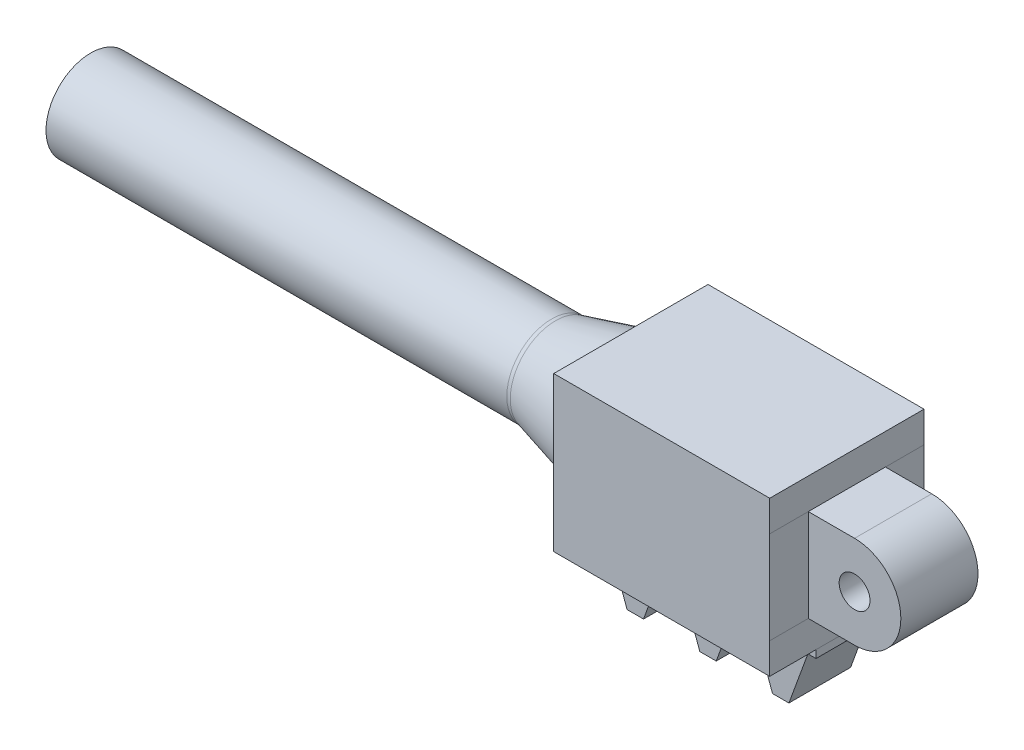
ISO-10303-21;
HEADER;
FILE_DESCRIPTION(('STEP AP214'),'2;1');
FILE_NAME('part.step','',(''),(''),'','','');
FILE_SCHEMA(('AUTOMOTIVE_DESIGN { 1 0 10303 214 1 1 1 1 }'));
ENDSEC;
DATA;
#1=APPLICATION_CONTEXT('core data for automotive mechanical design processes');
#2=APPLICATION_PROTOCOL_DEFINITION('international standard','automotive_design',2000,#1);
#3=PRODUCT_CONTEXT('',#1,'mechanical');
#4=PRODUCT('Part','Part','',(#3));
#5=PRODUCT_RELATED_PRODUCT_CATEGORY('part','',(#4));
#6=PRODUCT_DEFINITION_FORMATION('','',#4);
#7=PRODUCT_DEFINITION_CONTEXT('part definition',#1,'design');
#8=PRODUCT_DEFINITION('design','',#6,#7);
#9=PRODUCT_DEFINITION_SHAPE('','',#8);
#10=(LENGTH_UNIT() NAMED_UNIT(*) SI_UNIT(.MILLI.,.METRE.));
#11=(NAMED_UNIT(*) PLANE_ANGLE_UNIT() SI_UNIT($,.RADIAN.));
#12=(NAMED_UNIT(*) SI_UNIT($,.STERADIAN.) SOLID_ANGLE_UNIT());
#13=UNCERTAINTY_MEASURE_WITH_UNIT(LENGTH_MEASURE(1.E-05),#10,'distance_accuracy_value','');
#14=(GEOMETRIC_REPRESENTATION_CONTEXT(3) GLOBAL_UNCERTAINTY_ASSIGNED_CONTEXT((#13)) GLOBAL_UNIT_ASSIGNED_CONTEXT((#10,
#11,#12)) REPRESENTATION_CONTEXT('',''));
#15=CARTESIAN_POINT('',(0.,0.,0.));
#16=DIRECTION('',(0.,0.,1.));
#17=DIRECTION('',(1.,0.,0.));
#18=AXIS2_PLACEMENT_3D('',#15,#16,#17);
#19=CARTESIAN_POINT('',(3.00000009685755,-4.93749997019768,2.));
#20=DIRECTION('',(0.,0.,1.));
#21=DIRECTION('',(1.,0.,0.));
#22=AXIS2_PLACEMENT_3D('',#19,#20,#21);
#23=PLANE('',#22);
#24=DIRECTION('',(0.,-1.,0.));
#25=VECTOR('',#24,1.);
#26=CARTESIAN_POINT('',(-7.,-8.,2.));
#27=LINE('',#26,#25);
#28=CARTESIAN_POINT('',(-7.,-8.,2.));
#29=VERTEX_POINT('',#28);
#30=CARTESIAN_POINT('',(-7.,-8.5,2.));
#31=VERTEX_POINT('',#30);
#32=EDGE_CURVE('E9',#29,#31,#27,.T.);
#33=ORIENTED_EDGE('',*,*,#32,.T.);
#34=DIRECTION('',(1.,0.,0.));
#35=VECTOR('',#34,1.);
#36=CARTESIAN_POINT('',(-7.,-8.5,2.));
#37=LINE('',#36,#35);
#38=CARTESIAN_POINT('',(-6.47293,-8.5,2.));
#39=VERTEX_POINT('',#38);
#40=EDGE_CURVE('E18',#31,#39,#37,.T.);
#41=ORIENTED_EDGE('',*,*,#40,.T.);
#42=DIRECTION('',(0.342020010403122,-0.939692669165748,0.));
#43=VECTOR('',#42,1.);
#44=CARTESIAN_POINT('',(-6.47293,-8.5,2.));
#45=LINE('',#44,#43);
#46=CARTESIAN_POINT('',(-5.244531,-11.875,2.));
#47=VERTEX_POINT('',#46);
#48=EDGE_CURVE('E211',#39,#47,#45,.T.);
#49=ORIENTED_EDGE('',*,*,#48,.T.);
#50=DIRECTION('',(1.,0.,0.));
#51=VECTOR('',#50,1.);
#52=CARTESIAN_POINT('',(-5.244531,-11.875,2.));
#53=LINE('',#52,#51);
#54=CARTESIAN_POINT('',(-4.180247,-11.875,2.));
#55=VERTEX_POINT('',#54);
#56=EDGE_CURVE('E204',#47,#55,#53,.T.);
#57=ORIENTED_EDGE('',*,*,#56,.T.);
#58=DIRECTION('',(0.342020010403122,0.939692669165748,0.));
#59=VECTOR('',#58,1.);
#60=CARTESIAN_POINT('',(-4.180247,-11.875,2.));
#61=LINE('',#60,#59);
#62=CARTESIAN_POINT('',(-2.951848,-8.5,2.));
#63=VERTEX_POINT('',#62);
#64=EDGE_CURVE('E208',#55,#63,#61,.T.);
#65=ORIENTED_EDGE('',*,*,#64,.T.);
#66=DIRECTION('',(1.,0.,0.));
#67=VECTOR('',#66,1.);
#68=CARTESIAN_POINT('',(-2.951848,-8.5,2.));
#69=LINE('',#68,#67);
#70=CARTESIAN_POINT('',(-1.760541,-8.5,2.));
#71=VERTEX_POINT('',#70);
#72=EDGE_CURVE('E240',#63,#71,#69,.T.);
#73=ORIENTED_EDGE('',*,*,#72,.T.);
#74=DIRECTION('',(0.342020010403122,-0.939692669165748,0.));
#75=VECTOR('',#74,1.);
#76=CARTESIAN_POINT('',(-1.760541,-8.5,2.));
#77=LINE('',#76,#75);
#78=CARTESIAN_POINT('',(-0.532142,-11.875,2.));
#79=VERTEX_POINT('',#78);
#80=EDGE_CURVE('E237',#71,#79,#77,.T.);
#81=ORIENTED_EDGE('',*,*,#80,.T.);
#82=DIRECTION('',(1.,0.,0.));
#83=VECTOR('',#82,1.);
#84=CARTESIAN_POINT('',(-0.532142,-11.875,2.));
#85=LINE('',#84,#83);
#86=CARTESIAN_POINT('',(0.532142,-11.875,2.));
#87=VERTEX_POINT('',#86);
#88=EDGE_CURVE('E461',#79,#87,#85,.T.);
#89=ORIENTED_EDGE('',*,*,#88,.T.);
#90=DIRECTION('',(0.342020010403122,0.939692669165748,0.));
#91=VECTOR('',#90,1.);
#92=CARTESIAN_POINT('',(0.532142,-11.875,2.));
#93=LINE('',#92,#91);
#94=CARTESIAN_POINT('',(1.760541,-8.5,2.));
#95=VERTEX_POINT('',#94);
#96=EDGE_CURVE('E441',#87,#95,#93,.T.);
#97=ORIENTED_EDGE('',*,*,#96,.T.);
#98=DIRECTION('',(1.,0.,0.));
#99=VECTOR('',#98,1.);
#100=CARTESIAN_POINT('',(1.760541,-8.5,2.));
#101=LINE('',#100,#99);
#102=CARTESIAN_POINT('',(2.951848,-8.5,2.));
#103=VERTEX_POINT('',#102);
#104=EDGE_CURVE('E443',#95,#103,#101,.T.);
#105=ORIENTED_EDGE('',*,*,#104,.T.);
#106=DIRECTION('',(0.342020010403122,-0.939692669165748,0.));
#107=VECTOR('',#106,1.);
#108=CARTESIAN_POINT('',(2.951848,-8.5,2.));
#109=LINE('',#108,#107);
#110=CARTESIAN_POINT('',(4.180247,-11.875,2.));
#111=VERTEX_POINT('',#110);
#112=EDGE_CURVE('E480',#103,#111,#109,.T.);
#113=ORIENTED_EDGE('',*,*,#112,.T.);
#114=DIRECTION('',(1.,0.,0.));
#115=VECTOR('',#114,1.);
#116=CARTESIAN_POINT('',(4.180247,-11.875,2.));
#117=LINE('',#116,#115);
#118=CARTESIAN_POINT('',(5.244531,-11.875,2.));
#119=VERTEX_POINT('',#118);
#120=EDGE_CURVE('E292',#111,#119,#117,.T.);
#121=ORIENTED_EDGE('',*,*,#120,.T.);
#122=DIRECTION('',(0.342020010403122,0.939692669165748,0.));
#123=VECTOR('',#122,1.);
#124=CARTESIAN_POINT('',(5.244531,-11.875,2.));
#125=LINE('',#124,#123);
#126=CARTESIAN_POINT('',(6.47293,-8.5,2.));
#127=VERTEX_POINT('',#126);
#128=EDGE_CURVE('E369',#119,#127,#125,.T.);
#129=ORIENTED_EDGE('',*,*,#128,.T.);
#130=DIRECTION('',(1.,0.,0.));
#131=VECTOR('',#130,1.);
#132=CARTESIAN_POINT('',(6.47293,-8.5,2.));
#133=LINE('',#132,#131);
#134=CARTESIAN_POINT('',(7.,-8.5,2.));
#135=VERTEX_POINT('',#134);
#136=EDGE_CURVE('E464',#127,#135,#133,.T.);
#137=ORIENTED_EDGE('',*,*,#136,.T.);
#138=DIRECTION('',(0.,1.,0.));
#139=VECTOR('',#138,1.);
#140=CARTESIAN_POINT('',(7.,-8.5,2.));
#141=LINE('',#140,#139);
#142=CARTESIAN_POINT('',(7.,-8.,2.));
#143=VERTEX_POINT('',#142);
#144=EDGE_CURVE('E460',#135,#143,#141,.T.);
#145=ORIENTED_EDGE('',*,*,#144,.T.);
#146=DIRECTION('',(-1.,0.,0.));
#147=VECTOR('',#146,1.);
#148=CARTESIAN_POINT('',(7.,-8.,2.));
#149=LINE('',#148,#147);
#150=EDGE_CURVE('E338',#143,#29,#149,.T.);
#151=ORIENTED_EDGE('',*,*,#150,.T.);
#152=EDGE_LOOP('',(#33,#41,#49,#57,#65,#73,#81,#89,#97,#105,#113,#121,#129,#137,#145,#151));
#153=FACE_BOUND('',#152,.T.);
#154=ADVANCED_FACE('F15',(#153),#23,.T.);
#155=CARTESIAN_POINT('',(-7.,-8.,0.));
#156=DIRECTION('',(-1.,0.,0.));
#157=DIRECTION('',(0.,0.,1.));
#158=AXIS2_PLACEMENT_3D('',#155,#156,#157);
#159=PLANE('',#158);
#160=CARTESIAN_POINT('',(-7.,-2.89997804685105,0.0112839612717951));
#161=DIRECTION('',(1.,0.,0.));
#162=DIRECTION('',(0.,0.,-1.));
#163=AXIS2_PLACEMENT_3D('',#160,#161,#162);
#164=CIRCLE('',#163,4.23974596215561);
#165=CARTESIAN_POINT('',(-7.,-2.89997804685105,4.25102992342741));
#166=VERTEX_POINT('',#165);
#167=EDGE_CURVE('E615',#166,#166,#164,.T.);
#168=ORIENTED_EDGE('',*,*,#167,.T.);
#169=EDGE_LOOP('',(#168));
#170=FACE_BOUND('',#169,.T.);
#171=DIRECTION('',(0.,0.,1.));
#172=VECTOR('',#171,1.);
#173=CARTESIAN_POINT('',(-7.,-8.5,0.));
#174=LINE('',#173,#172);
#175=CARTESIAN_POINT('',(-7.,-8.5,-2.));
#176=VERTEX_POINT('',#175);
#177=EDGE_CURVE('E24',#176,#31,#174,.T.);
#178=ORIENTED_EDGE('',*,*,#177,.T.);
#179=ORIENTED_EDGE('',*,*,#32,.F.);
#180=DIRECTION('',(0.,0.,1.));
#181=VECTOR('',#180,1.);
#182=CARTESIAN_POINT('',(-7.,-8.,0.));
#183=LINE('',#182,#181);
#184=CARTESIAN_POINT('',(-7.,-8.,5.));
#185=VERTEX_POINT('',#184);
#186=EDGE_CURVE('E354',#29,#185,#183,.T.);
#187=ORIENTED_EDGE('',*,*,#186,.T.);
#188=DIRECTION('',(0.,-1.,0.));
#189=VECTOR('',#188,1.);
#190=CARTESIAN_POINT('',(-7.,2.00000005960464,5.));
#191=LINE('',#190,#189);
#192=CARTESIAN_POINT('',(-7.,2.00000005960464,5.));
#193=VERTEX_POINT('',#192);
#194=EDGE_CURVE('E394',#193,#185,#191,.T.);
#195=ORIENTED_EDGE('',*,*,#194,.F.);
#196=DIRECTION('',(0.,0.,1.));
#197=VECTOR('',#196,1.);
#198=CARTESIAN_POINT('',(-7.,2.00000005960464,0.));
#199=LINE('',#198,#197);
#200=CARTESIAN_POINT('',(-7.,2.00000005960464,-5.));
#201=VERTEX_POINT('',#200);
#202=EDGE_CURVE('E384',#201,#193,#199,.T.);
#203=ORIENTED_EDGE('',*,*,#202,.F.);
#204=DIRECTION('',(0.,1.,0.));
#205=VECTOR('',#204,1.);
#206=CARTESIAN_POINT('',(-7.,2.00000005960464,-5.));
#207=LINE('',#206,#205);
#208=CARTESIAN_POINT('',(-7.,-8.,-5.));
#209=VERTEX_POINT('',#208);
#210=EDGE_CURVE('E350',#209,#201,#207,.T.);
#211=ORIENTED_EDGE('',*,*,#210,.F.);
#212=DIRECTION('',(0.,0.,1.));
#213=VECTOR('',#212,1.);
#214=CARTESIAN_POINT('',(-7.,-8.,0.));
#215=LINE('',#214,#213);
#216=CARTESIAN_POINT('',(-7.,-8.,-2.));
#217=VERTEX_POINT('',#216);
#218=EDGE_CURVE('E313',#209,#217,#215,.T.);
#219=ORIENTED_EDGE('',*,*,#218,.T.);
#220=DIRECTION('',(0.,1.,0.));
#221=VECTOR('',#220,1.);
#222=CARTESIAN_POINT('',(-7.,-8.,-2.));
#223=LINE('',#222,#221);
#224=EDGE_CURVE('E396',#176,#217,#223,.T.);
#225=ORIENTED_EDGE('',*,*,#224,.F.);
#226=EDGE_LOOP('',(#178,#179,#187,#195,#203,#211,#219,#225));
#227=FACE_BOUND('',#226,.T.);
#228=ADVANCED_FACE('F698',(#170,#227),#159,.T.);
#229=CARTESIAN_POINT('',(-7.,-8.5,0.));
#230=DIRECTION('',(0.,-1.,0.));
#231=DIRECTION('',(0.,0.,-1.));
#232=AXIS2_PLACEMENT_3D('',#229,#230,#231);
#233=PLANE('',#232);
#234=DIRECTION('',(0.,0.,1.));
#235=VECTOR('',#234,1.);
#236=CARTESIAN_POINT('',(-6.47293,-8.5,0.));
#237=LINE('',#236,#235);
#238=CARTESIAN_POINT('',(-6.47293,-8.5,-2.));
#239=VERTEX_POINT('',#238);
#240=EDGE_CURVE('E242',#239,#39,#237,.T.);
#241=ORIENTED_EDGE('',*,*,#240,.T.);
#242=ORIENTED_EDGE('',*,*,#40,.F.);
#243=ORIENTED_EDGE('',*,*,#177,.F.);
#244=DIRECTION('',(-1.,0.,0.));
#245=VECTOR('',#244,1.);
#246=CARTESIAN_POINT('',(-7.,-8.5,-2.));
#247=LINE('',#246,#245);
#248=EDGE_CURVE('E455',#239,#176,#247,.T.);
#249=ORIENTED_EDGE('',*,*,#248,.F.);
#250=EDGE_LOOP('',(#241,#242,#243,#249));
#251=FACE_BOUND('',#250,.T.);
#252=ADVANCED_FACE('F697',(#251),#233,.T.);
#253=CARTESIAN_POINT('',(-6.47293,-8.5,0.));
#254=DIRECTION('',(-0.939692669165748,-0.342020010403122,0.));
#255=DIRECTION('',(-0.342020010403122,0.939692669165748,0.));
#256=AXIS2_PLACEMENT_3D('',#253,#254,#255);
#257=PLANE('',#256);
#258=DIRECTION('',(0.,0.,1.));
#259=VECTOR('',#258,1.);
#260=CARTESIAN_POINT('',(-5.244531,-11.875,0.));
#261=LINE('',#260,#259);
#262=CARTESIAN_POINT('',(-5.244531,-11.875,-2.));
#263=VERTEX_POINT('',#262);
#264=EDGE_CURVE('E214',#263,#47,#261,.T.);
#265=ORIENTED_EDGE('',*,*,#264,.T.);
#266=ORIENTED_EDGE('',*,*,#48,.F.);
#267=ORIENTED_EDGE('',*,*,#240,.F.);
#268=DIRECTION('',(-0.342020010403122,0.939692669165748,0.));
#269=VECTOR('',#268,1.);
#270=CARTESIAN_POINT('',(-6.47293,-8.5,-2.));
#271=LINE('',#270,#269);
#272=EDGE_CURVE('E449',#263,#239,#271,.T.);
#273=ORIENTED_EDGE('',*,*,#272,.F.);
#274=EDGE_LOOP('',(#265,#266,#267,#273));
#275=FACE_BOUND('',#274,.T.);
#276=ADVANCED_FACE('F704',(#275),#257,.T.);
#277=CARTESIAN_POINT('',(-5.244531,-11.875,0.));
#278=DIRECTION('',(0.,-1.,0.));
#279=DIRECTION('',(0.,0.,-1.));
#280=AXIS2_PLACEMENT_3D('',#277,#278,#279);
#281=PLANE('',#280);
#282=DIRECTION('',(0.,0.,1.));
#283=VECTOR('',#282,1.);
#284=CARTESIAN_POINT('',(-4.180247,-11.875,0.));
#285=LINE('',#284,#283);
#286=CARTESIAN_POINT('',(-4.180247,-11.875,-2.));
#287=VERTEX_POINT('',#286);
#288=EDGE_CURVE('E216',#287,#55,#285,.T.);
#289=ORIENTED_EDGE('',*,*,#288,.T.);
#290=ORIENTED_EDGE('',*,*,#56,.F.);
#291=ORIENTED_EDGE('',*,*,#264,.F.);
#292=DIRECTION('',(-1.,0.,0.));
#293=VECTOR('',#292,1.);
#294=CARTESIAN_POINT('',(-5.244531,-11.875,-2.));
#295=LINE('',#294,#293);
#296=EDGE_CURVE('E222',#287,#263,#295,.T.);
#297=ORIENTED_EDGE('',*,*,#296,.F.);
#298=EDGE_LOOP('',(#289,#290,#291,#297));
#299=FACE_BOUND('',#298,.T.);
#300=ADVANCED_FACE('F218',(#299),#281,.T.);
#301=CARTESIAN_POINT('',(-4.180247,-11.875,0.));
#302=DIRECTION('',(0.939692669165748,-0.342020010403122,0.));
#303=DIRECTION('',(0.,0.,-1.));
#304=AXIS2_PLACEMENT_3D('',#301,#302,#303);
#305=PLANE('',#304);
#306=DIRECTION('',(0.,0.,1.));
#307=VECTOR('',#306,1.);
#308=CARTESIAN_POINT('',(-2.951848,-8.5,0.));
#309=LINE('',#308,#307);
#310=CARTESIAN_POINT('',(-2.951848,-8.5,-2.));
#311=VERTEX_POINT('',#310);
#312=EDGE_CURVE('E229',#311,#63,#309,.T.);
#313=ORIENTED_EDGE('',*,*,#312,.T.);
#314=ORIENTED_EDGE('',*,*,#64,.F.);
#315=ORIENTED_EDGE('',*,*,#288,.F.);
#316=DIRECTION('',(-0.342020010403122,-0.939692669165748,0.));
#317=VECTOR('',#316,1.);
#318=CARTESIAN_POINT('',(-4.180247,-11.875,-2.));
#319=LINE('',#318,#317);
#320=EDGE_CURVE('E440',#311,#287,#319,.T.);
#321=ORIENTED_EDGE('',*,*,#320,.F.);
#322=EDGE_LOOP('',(#313,#314,#315,#321));
#323=FACE_BOUND('',#322,.T.);
#324=ADVANCED_FACE('F227',(#323),#305,.T.);
#325=CARTESIAN_POINT('',(-2.951848,-8.5,0.));
#326=DIRECTION('',(0.,-1.,0.));
#327=DIRECTION('',(0.,0.,-1.));
#328=AXIS2_PLACEMENT_3D('',#325,#326,#327);
#329=PLANE('',#328);
#330=DIRECTION('',(0.,0.,1.));
#331=VECTOR('',#330,1.);
#332=CARTESIAN_POINT('',(-1.760541,-8.5,0.));
#333=LINE('',#332,#331);
#334=CARTESIAN_POINT('',(-1.760541,-8.5,-2.));
#335=VERTEX_POINT('',#334);
#336=EDGE_CURVE('E416',#335,#71,#333,.T.);
#337=ORIENTED_EDGE('',*,*,#336,.T.);
#338=ORIENTED_EDGE('',*,*,#72,.F.);
#339=ORIENTED_EDGE('',*,*,#312,.F.);
#340=DIRECTION('',(-1.,0.,0.));
#341=VECTOR('',#340,1.);
#342=CARTESIAN_POINT('',(-2.951848,-8.5,-2.));
#343=LINE('',#342,#341);
#344=EDGE_CURVE('E433',#335,#311,#343,.T.);
#345=ORIENTED_EDGE('',*,*,#344,.F.);
#346=EDGE_LOOP('',(#337,#338,#339,#345));
#347=FACE_BOUND('',#346,.T.);
#348=ADVANCED_FACE('F713',(#347),#329,.T.);
#349=CARTESIAN_POINT('',(-1.760541,-8.5,0.));
#350=DIRECTION('',(-0.939692669165748,-0.342020010403122,0.));
#351=DIRECTION('',(-0.342020010403122,0.939692669165748,0.));
#352=AXIS2_PLACEMENT_3D('',#349,#350,#351);
#353=PLANE('',#352);
#354=DIRECTION('',(0.,0.,1.));
#355=VECTOR('',#354,1.);
#356=CARTESIAN_POINT('',(-0.532142,-11.875,0.));
#357=LINE('',#356,#355);
#358=CARTESIAN_POINT('',(-0.532142,-11.875,-2.));
#359=VERTEX_POINT('',#358);
#360=EDGE_CURVE('E490',#359,#79,#357,.T.);
#361=ORIENTED_EDGE('',*,*,#360,.T.);
#362=ORIENTED_EDGE('',*,*,#80,.F.);
#363=ORIENTED_EDGE('',*,*,#336,.F.);
#364=DIRECTION('',(-0.342020010403122,0.939692669165748,0.));
#365=VECTOR('',#364,1.);
#366=CARTESIAN_POINT('',(-1.760541,-8.5,-2.));
#367=LINE('',#366,#365);
#368=EDGE_CURVE('E427',#359,#335,#367,.T.);
#369=ORIENTED_EDGE('',*,*,#368,.F.);
#370=EDGE_LOOP('',(#361,#362,#363,#369));
#371=FACE_BOUND('',#370,.T.);
#372=ADVANCED_FACE('F496',(#371),#353,.T.);
#373=CARTESIAN_POINT('',(-0.532142,-11.875,0.));
#374=DIRECTION('',(0.,-1.,0.));
#375=DIRECTION('',(0.,0.,-1.));
#376=AXIS2_PLACEMENT_3D('',#373,#374,#375);
#377=PLANE('',#376);
#378=DIRECTION('',(0.,0.,1.));
#379=VECTOR('',#378,1.);
#380=CARTESIAN_POINT('',(0.532142,-11.875,0.));
#381=LINE('',#380,#379);
#382=CARTESIAN_POINT('',(0.532142,-11.875,-2.));
#383=VERTEX_POINT('',#382);
#384=EDGE_CURVE('E456',#383,#87,#381,.T.);
#385=ORIENTED_EDGE('',*,*,#384,.T.);
#386=ORIENTED_EDGE('',*,*,#88,.F.);
#387=ORIENTED_EDGE('',*,*,#360,.F.);
#388=DIRECTION('',(-1.,0.,0.));
#389=VECTOR('',#388,1.);
#390=CARTESIAN_POINT('',(-0.532142,-11.875,-2.));
#391=LINE('',#390,#389);
#392=EDGE_CURVE('E422',#383,#359,#391,.T.);
#393=ORIENTED_EDGE('',*,*,#392,.F.);
#394=EDGE_LOOP('',(#385,#386,#387,#393));
#395=FACE_BOUND('',#394,.T.);
#396=ADVANCED_FACE('F718',(#395),#377,.T.);
#397=CARTESIAN_POINT('',(0.532142,-11.875,0.));
#398=DIRECTION('',(0.939692669165748,-0.342020010403122,0.));
#399=DIRECTION('',(0.,0.,-1.));
#400=AXIS2_PLACEMENT_3D('',#397,#398,#399);
#401=PLANE('',#400);
#402=DIRECTION('',(0.,0.,1.));
#403=VECTOR('',#402,1.);
#404=CARTESIAN_POINT('',(1.760541,-8.5,0.));
#405=LINE('',#404,#403);
#406=CARTESIAN_POINT('',(1.760541,-8.5,-2.));
#407=VERTEX_POINT('',#406);
#408=EDGE_CURVE('E439',#407,#95,#405,.T.);
#409=ORIENTED_EDGE('',*,*,#408,.T.);
#410=ORIENTED_EDGE('',*,*,#96,.F.);
#411=ORIENTED_EDGE('',*,*,#384,.F.);
#412=DIRECTION('',(-0.342020010403122,-0.939692669165748,0.));
#413=VECTOR('',#412,1.);
#414=CARTESIAN_POINT('',(0.532142,-11.875,-2.));
#415=LINE('',#414,#413);
#416=EDGE_CURVE('E417',#407,#383,#415,.T.);
#417=ORIENTED_EDGE('',*,*,#416,.F.);
#418=EDGE_LOOP('',(#409,#410,#411,#417));
#419=FACE_BOUND('',#418,.T.);
#420=ADVANCED_FACE('F724',(#419),#401,.T.);
#421=CARTESIAN_POINT('',(1.760541,-8.5,0.));
#422=DIRECTION('',(0.,-1.,0.));
#423=DIRECTION('',(0.,0.,-1.));
#424=AXIS2_PLACEMENT_3D('',#421,#422,#423);
#425=PLANE('',#424);
#426=DIRECTION('',(0.,0.,1.));
#427=VECTOR('',#426,1.);
#428=CARTESIAN_POINT('',(2.951848,-8.5,0.));
#429=LINE('',#428,#427);
#430=CARTESIAN_POINT('',(2.951848,-8.5,-2.));
#431=VERTEX_POINT('',#430);
#432=EDGE_CURVE('E476',#431,#103,#429,.T.);
#433=ORIENTED_EDGE('',*,*,#432,.T.);
#434=ORIENTED_EDGE('',*,*,#104,.F.);
#435=ORIENTED_EDGE('',*,*,#408,.F.);
#436=DIRECTION('',(-1.,0.,0.));
#437=VECTOR('',#436,1.);
#438=CARTESIAN_POINT('',(1.760541,-8.5,-2.));
#439=LINE('',#438,#437);
#440=EDGE_CURVE('E413',#431,#407,#439,.T.);
#441=ORIENTED_EDGE('',*,*,#440,.F.);
#442=EDGE_LOOP('',(#433,#434,#435,#441));
#443=FACE_BOUND('',#442,.T.);
#444=ADVANCED_FACE('F566',(#443),#425,.T.);
#445=CARTESIAN_POINT('',(2.951848,-8.5,0.));
#446=DIRECTION('',(-0.939692669165748,-0.342020010403122,0.));
#447=DIRECTION('',(-0.342020010403122,0.939692669165748,0.));
#448=AXIS2_PLACEMENT_3D('',#445,#446,#447);
#449=PLANE('',#448);
#450=DIRECTION('',(0.,0.,1.));
#451=VECTOR('',#450,1.);
#452=CARTESIAN_POINT('',(4.180247,-11.875,0.));
#453=LINE('',#452,#451);
#454=CARTESIAN_POINT('',(4.180247,-11.875,-2.));
#455=VERTEX_POINT('',#454);
#456=EDGE_CURVE('E300',#455,#111,#453,.T.);
#457=ORIENTED_EDGE('',*,*,#456,.T.);
#458=ORIENTED_EDGE('',*,*,#112,.F.);
#459=ORIENTED_EDGE('',*,*,#432,.F.);
#460=DIRECTION('',(-0.342020010403122,0.939692669165748,0.));
#461=VECTOR('',#460,1.);
#462=CARTESIAN_POINT('',(2.951848,-8.5,-2.));
#463=LINE('',#462,#461);
#464=EDGE_CURVE('E408',#455,#431,#463,.T.);
#465=ORIENTED_EDGE('',*,*,#464,.F.);
#466=EDGE_LOOP('',(#457,#458,#459,#465));
#467=FACE_BOUND('',#466,.T.);
#468=ADVANCED_FACE('F562',(#467),#449,.T.);
#469=CARTESIAN_POINT('',(4.180247,-11.875,0.));
#470=DIRECTION('',(0.,-1.,0.));
#471=DIRECTION('',(0.,0.,-1.));
#472=AXIS2_PLACEMENT_3D('',#469,#470,#471);
#473=PLANE('',#472);
#474=DIRECTION('',(0.,0.,1.));
#475=VECTOR('',#474,1.);
#476=CARTESIAN_POINT('',(5.244531,-11.875,0.));
#477=LINE('',#476,#475);
#478=CARTESIAN_POINT('',(5.244531,-11.875,-2.));
#479=VERTEX_POINT('',#478);
#480=EDGE_CURVE('E297',#479,#119,#477,.T.);
#481=ORIENTED_EDGE('',*,*,#480,.T.);
#482=ORIENTED_EDGE('',*,*,#120,.F.);
#483=ORIENTED_EDGE('',*,*,#456,.F.);
#484=DIRECTION('',(-1.,0.,0.));
#485=VECTOR('',#484,1.);
#486=CARTESIAN_POINT('',(4.180247,-11.875,-2.));
#487=LINE('',#486,#485);
#488=EDGE_CURVE('E290',#479,#455,#487,.T.);
#489=ORIENTED_EDGE('',*,*,#488,.F.);
#490=EDGE_LOOP('',(#481,#482,#483,#489));
#491=FACE_BOUND('',#490,.T.);
#492=ADVANCED_FACE('F573',(#491),#473,.T.);
#493=CARTESIAN_POINT('',(5.244531,-11.875,0.));
#494=DIRECTION('',(0.939692669165748,-0.342020010403122,0.));
#495=DIRECTION('',(0.,0.,-1.));
#496=AXIS2_PLACEMENT_3D('',#493,#494,#495);
#497=PLANE('',#496);
#498=DIRECTION('',(0.,0.,1.));
#499=VECTOR('',#498,1.);
#500=CARTESIAN_POINT('',(6.47293,-8.5,0.));
#501=LINE('',#500,#499);
#502=CARTESIAN_POINT('',(6.47293,-8.5,-2.));
#503=VERTEX_POINT('',#502);
#504=EDGE_CURVE('E468',#503,#127,#501,.T.);
#505=ORIENTED_EDGE('',*,*,#504,.T.);
#506=ORIENTED_EDGE('',*,*,#128,.F.);
#507=ORIENTED_EDGE('',*,*,#480,.F.);
#508=DIRECTION('',(-0.342020010403122,-0.939692669165748,0.));
#509=VECTOR('',#508,1.);
#510=CARTESIAN_POINT('',(5.244531,-11.875,-2.));
#511=LINE('',#510,#509);
#512=EDGE_CURVE('E284',#503,#479,#511,.T.);
#513=ORIENTED_EDGE('',*,*,#512,.F.);
#514=EDGE_LOOP('',(#505,#506,#507,#513));
#515=FACE_BOUND('',#514,.T.);
#516=ADVANCED_FACE('F731',(#515),#497,.T.);
#517=CARTESIAN_POINT('',(6.47293,-8.5,0.));
#518=DIRECTION('',(0.,-1.,0.));
#519=DIRECTION('',(0.,0.,-1.));
#520=AXIS2_PLACEMENT_3D('',#517,#518,#519);
#521=PLANE('',#520);
#522=DIRECTION('',(0.,0.,1.));
#523=VECTOR('',#522,1.);
#524=CARTESIAN_POINT('',(7.,-8.5,0.));
#525=LINE('',#524,#523);
#526=CARTESIAN_POINT('',(7.,-8.5,-2.));
#527=VERTEX_POINT('',#526);
#528=EDGE_CURVE('E463',#527,#135,#525,.T.);
#529=ORIENTED_EDGE('',*,*,#528,.T.);
#530=ORIENTED_EDGE('',*,*,#136,.F.);
#531=ORIENTED_EDGE('',*,*,#504,.F.);
#532=DIRECTION('',(-1.,0.,0.));
#533=VECTOR('',#532,1.);
#534=CARTESIAN_POINT('',(6.47293,-8.5,-2.));
#535=LINE('',#534,#533);
#536=EDGE_CURVE('E288',#527,#503,#535,.T.);
#537=ORIENTED_EDGE('',*,*,#536,.F.);
#538=EDGE_LOOP('',(#529,#530,#531,#537));
#539=FACE_BOUND('',#538,.T.);
#540=ADVANCED_FACE('F734',(#539),#521,.T.);
#541=CARTESIAN_POINT('',(7.,-8.5,0.));
#542=DIRECTION('',(1.,0.,0.));
#543=DIRECTION('',(0.,1.,0.));
#544=AXIS2_PLACEMENT_3D('',#541,#542,#543);
#545=PLANE('',#544);
#546=DIRECTION('',(0.,0.,1.));
#547=VECTOR('',#546,1.);
#548=CARTESIAN_POINT('',(7.,-8.,0.));
#549=LINE('',#548,#547);
#550=CARTESIAN_POINT('',(7.,-8.,-2.));
#551=VERTEX_POINT('',#550);
#552=EDGE_CURVE('E381',#551,#143,#549,.T.);
#553=ORIENTED_EDGE('',*,*,#552,.T.);
#554=ORIENTED_EDGE('',*,*,#144,.F.);
#555=ORIENTED_EDGE('',*,*,#528,.F.);
#556=DIRECTION('',(0.,-1.,0.));
#557=VECTOR('',#556,1.);
#558=CARTESIAN_POINT('',(7.,-8.5,-2.));
#559=LINE('',#558,#557);
#560=EDGE_CURVE('E397',#551,#527,#559,.T.);
#561=ORIENTED_EDGE('',*,*,#560,.F.);
#562=EDGE_LOOP('',(#553,#554,#555,#561));
#563=FACE_BOUND('',#562,.T.);
#564=ADVANCED_FACE('F738',(#563),#545,.T.);
#565=CARTESIAN_POINT('',(3.00000009685755,-4.93749997019768,-2.));
#566=DIRECTION('',(0.,0.,-1.));
#567=DIRECTION('',(0.,-1.,0.));
#568=AXIS2_PLACEMENT_3D('',#565,#566,#567);
#569=PLANE('',#568);
#570=ORIENTED_EDGE('',*,*,#224,.T.);
#571=DIRECTION('',(1.,0.,0.));
#572=VECTOR('',#571,1.);
#573=CARTESIAN_POINT('',(7.,-8.,-2.));
#574=LINE('',#573,#572);
#575=EDGE_CURVE('E316',#217,#551,#574,.T.);
#576=ORIENTED_EDGE('',*,*,#575,.T.);
#577=ORIENTED_EDGE('',*,*,#560,.T.);
#578=ORIENTED_EDGE('',*,*,#536,.T.);
#579=ORIENTED_EDGE('',*,*,#512,.T.);
#580=ORIENTED_EDGE('',*,*,#488,.T.);
#581=ORIENTED_EDGE('',*,*,#464,.T.);
#582=ORIENTED_EDGE('',*,*,#440,.T.);
#583=ORIENTED_EDGE('',*,*,#416,.T.);
#584=ORIENTED_EDGE('',*,*,#392,.T.);
#585=ORIENTED_EDGE('',*,*,#368,.T.);
#586=ORIENTED_EDGE('',*,*,#344,.T.);
#587=ORIENTED_EDGE('',*,*,#320,.T.);
#588=ORIENTED_EDGE('',*,*,#296,.T.);
#589=ORIENTED_EDGE('',*,*,#272,.T.);
#590=ORIENTED_EDGE('',*,*,#248,.T.);
#591=EDGE_LOOP('',(#570,#576,#577,#578,#579,#580,#581,#582,#583,#584,#585,#586,#587,#588,#589,#590));
#592=FACE_BOUND('',#591,.T.);
#593=ADVANCED_FACE('F569',(#592),#569,.T.);
#594=CARTESIAN_POINT('',(3.00000009685755,-4.93749997019768,5.));
#595=DIRECTION('',(0.,0.,1.));
#596=DIRECTION('',(1.,0.,0.));
#597=AXIS2_PLACEMENT_3D('',#594,#595,#596);
#598=PLANE('',#597);
#599=DIRECTION('',(-1.,0.,0.));
#600=VECTOR('',#599,1.);
#601=CARTESIAN_POINT('',(7.00000010430813,2.00000005960464,5.));
#602=LINE('',#601,#600);
#603=CARTESIAN_POINT('',(7.00000010430813,2.00000005960464,5.));
#604=VERTEX_POINT('',#603);
#605=EDGE_CURVE('E386',#604,#193,#602,.T.);
#606=ORIENTED_EDGE('',*,*,#605,.T.);
#607=ORIENTED_EDGE('',*,*,#194,.T.);
#608=DIRECTION('',(1.,0.,0.));
#609=VECTOR('',#608,1.);
#610=CARTESIAN_POINT('',(7.,-8.,5.));
#611=LINE('',#610,#609);
#612=CARTESIAN_POINT('',(7.,-8.,5.));
#613=VERTEX_POINT('',#612);
#614=EDGE_CURVE('E351',#185,#613,#611,.T.);
#615=ORIENTED_EDGE('',*,*,#614,.T.);
#616=DIRECTION('',(1.04308127069075E-08,1.,0.));
#617=VECTOR('',#616,1.);
#618=CARTESIAN_POINT('',(7.00000010430813,2.00000005960464,5.));
#619=LINE('',#618,#617);
#620=CARTESIAN_POINT('',(7.00000010430813,-6.00000005960465,5.));
#621=VERTEX_POINT('',#620);
#622=EDGE_CURVE('E378',#613,#621,#619,.T.);
#623=ORIENTED_EDGE('',*,*,#622,.T.);
#624=DIRECTION('',(0.,1.,0.));
#625=VECTOR('',#624,1.);
#626=CARTESIAN_POINT('',(7.00000010430813,-6.00000005960465,5.));
#627=LINE('',#626,#625);
#628=CARTESIAN_POINT('',(7.00000010430813,2.98023217215615E-08,5.));
#629=VERTEX_POINT('',#628);
#630=EDGE_CURVE('E321',#621,#629,#627,.T.);
#631=ORIENTED_EDGE('',*,*,#630,.T.);
#632=DIRECTION('',(1.04308127069075E-08,1.,0.));
#633=VECTOR('',#632,1.);
#634=CARTESIAN_POINT('',(7.00000010430813,2.00000005960464,5.));
#635=LINE('',#634,#633);
#636=EDGE_CURVE('E372',#629,#604,#635,.T.);
#637=ORIENTED_EDGE('',*,*,#636,.T.);
#638=EDGE_LOOP('',(#606,#607,#615,#623,#631,#637));
#639=FACE_BOUND('',#638,.T.);
#640=ADVANCED_FACE('F748',(#639),#598,.T.);
#641=CARTESIAN_POINT('',(7.00000010430813,2.00000005960464,0.));
#642=DIRECTION('',(0.,1.,0.));
#643=DIRECTION('',(1.,0.,0.));
#644=AXIS2_PLACEMENT_3D('',#641,#642,#643);
#645=PLANE('',#644);
#646=ORIENTED_EDGE('',*,*,#202,.T.);
#647=ORIENTED_EDGE('',*,*,#605,.F.);
#648=DIRECTION('',(0.,0.,-1.));
#649=VECTOR('',#648,1.);
#650=CARTESIAN_POINT('',(7.00000010430813,2.00000005960464,0.));
#651=LINE('',#650,#649);
#652=CARTESIAN_POINT('',(7.00000010430813,2.00000005960464,-5.));
#653=VERTEX_POINT('',#652);
#654=EDGE_CURVE('E373',#604,#653,#651,.T.);
#655=ORIENTED_EDGE('',*,*,#654,.T.);
#656=DIRECTION('',(1.,0.,0.));
#657=VECTOR('',#656,1.);
#658=CARTESIAN_POINT('',(7.00000010430813,2.00000005960464,-5.));
#659=LINE('',#658,#657);
#660=EDGE_CURVE('E357',#201,#653,#659,.T.);
#661=ORIENTED_EDGE('',*,*,#660,.F.);
#662=EDGE_LOOP('',(#646,#647,#655,#661));
#663=FACE_BOUND('',#662,.T.);
#664=ADVANCED_FACE('F750',(#663),#645,.T.);
#665=CARTESIAN_POINT('',(7.,-8.,0.));
#666=DIRECTION('',(1.,-1.04308127069075E-08,0.));
#667=DIRECTION('',(0.,0.,-1.));
#668=AXIS2_PLACEMENT_3D('',#665,#666,#667);
#669=PLANE('',#668);
#670=DIRECTION('',(0.,0.,1.));
#671=VECTOR('',#670,1.);
#672=CARTESIAN_POINT('',(7.00000010430813,-6.00000005960465,0.));
#673=LINE('',#672,#671);
#674=CARTESIAN_POINT('',(7.00000010430813,-6.00000005960465,-5.));
#675=VERTEX_POINT('',#674);
#676=CARTESIAN_POINT('',(7.00000010430813,-6.00000005960465,-2.5));
#677=VERTEX_POINT('',#676);
#678=EDGE_CURVE('E301',#675,#677,#673,.T.);
#679=ORIENTED_EDGE('',*,*,#678,.T.);
#680=DIRECTION('',(0.,0.,1.));
#681=VECTOR('',#680,1.);
#682=CARTESIAN_POINT('',(7.00000010430813,-6.00000005960465,0.));
#683=LINE('',#682,#681);
#684=CARTESIAN_POINT('',(7.00000010430813,-6.00000005960465,2.5));
#685=VERTEX_POINT('',#684);
#686=EDGE_CURVE('E287',#677,#685,#683,.T.);
#687=ORIENTED_EDGE('',*,*,#686,.T.);
#688=DIRECTION('',(0.,0.,1.));
#689=VECTOR('',#688,1.);
#690=CARTESIAN_POINT('',(7.00000010430813,-6.00000005960465,0.));
#691=LINE('',#690,#689);
#692=EDGE_CURVE('E324',#685,#621,#691,.T.);
#693=ORIENTED_EDGE('',*,*,#692,.T.);
#694=ORIENTED_EDGE('',*,*,#622,.F.);
#695=DIRECTION('',(0.,0.,1.));
#696=VECTOR('',#695,1.);
#697=CARTESIAN_POINT('',(7.,-8.,0.));
#698=LINE('',#697,#696);
#699=EDGE_CURVE('E345',#143,#613,#698,.T.);
#700=ORIENTED_EDGE('',*,*,#699,.F.);
#701=ORIENTED_EDGE('',*,*,#552,.F.);
#702=DIRECTION('',(0.,0.,1.));
#703=VECTOR('',#702,1.);
#704=CARTESIAN_POINT('',(7.,-8.,0.));
#705=LINE('',#704,#703);
#706=CARTESIAN_POINT('',(7.,-8.,-5.));
#707=VERTEX_POINT('',#706);
#708=EDGE_CURVE('E333',#707,#551,#705,.T.);
#709=ORIENTED_EDGE('',*,*,#708,.F.);
#710=DIRECTION('',(-1.04308127069075E-08,-1.,0.));
#711=VECTOR('',#710,1.);
#712=CARTESIAN_POINT('',(7.00000010430813,2.00000005960464,-5.));
#713=LINE('',#712,#711);
#714=EDGE_CURVE('E343',#675,#707,#713,.T.);
#715=ORIENTED_EDGE('',*,*,#714,.F.);
#716=EDGE_LOOP('',(#679,#687,#693,#694,#700,#701,#709,#715));
#717=FACE_BOUND('',#716,.T.);
#718=ADVANCED_FACE('F678',(#717),#669,.T.);
#719=CARTESIAN_POINT('',(7.0000000834465,2.98023217215615E-08,0.));
#720=DIRECTION('',(1.,-1.04308127069075E-08,0.));
#721=DIRECTION('',(0.,0.,-1.));
#722=AXIS2_PLACEMENT_3D('',#719,#720,#721);
#723=PLANE('',#722);
#724=ORIENTED_EDGE('',*,*,#654,.F.);
#725=ORIENTED_EDGE('',*,*,#636,.F.);
#726=DIRECTION('',(0.,0.,1.));
#727=VECTOR('',#726,1.);
#728=CARTESIAN_POINT('',(7.00000010430813,2.98023217215615E-08,0.));
#729=LINE('',#728,#727);
#730=CARTESIAN_POINT('',(7.00000010430813,2.98023217215615E-08,2.5));
#731=VERTEX_POINT('',#730);
#732=EDGE_CURVE('E320',#731,#629,#729,.T.);
#733=ORIENTED_EDGE('',*,*,#732,.F.);
#734=DIRECTION('',(0.,0.,1.));
#735=VECTOR('',#734,1.);
#736=CARTESIAN_POINT('',(7.00000010430813,2.98023217215615E-08,0.));
#737=LINE('',#736,#735);
#738=CARTESIAN_POINT('',(7.00000010430813,2.98023217215615E-08,-2.5));
#739=VERTEX_POINT('',#738);
#740=EDGE_CURVE('E266',#739,#731,#737,.T.);
#741=ORIENTED_EDGE('',*,*,#740,.F.);
#742=DIRECTION('',(0.,0.,1.));
#743=VECTOR('',#742,1.);
#744=CARTESIAN_POINT('',(7.00000010430813,2.98023217215615E-08,0.));
#745=LINE('',#744,#743);
#746=CARTESIAN_POINT('',(7.00000010430813,2.98023217215615E-08,-5.));
#747=VERTEX_POINT('',#746);
#748=EDGE_CURVE('E309',#747,#739,#745,.T.);
#749=ORIENTED_EDGE('',*,*,#748,.F.);
#750=DIRECTION('',(-1.04308127069075E-08,-1.,0.));
#751=VECTOR('',#750,1.);
#752=CARTESIAN_POINT('',(7.00000010430813,2.00000005960464,-5.));
#753=LINE('',#752,#751);
#754=EDGE_CURVE('E346',#653,#747,#753,.T.);
#755=ORIENTED_EDGE('',*,*,#754,.F.);
#756=EDGE_LOOP('',(#724,#725,#733,#741,#749,#755));
#757=FACE_BOUND('',#756,.T.);
#758=ADVANCED_FACE('F671',(#757),#723,.T.);
#759=CARTESIAN_POINT('',(3.00000009685755,-4.93749997019768,-5.));
#760=DIRECTION('',(0.,0.,-1.));
#761=DIRECTION('',(0.,-1.,0.));
#762=AXIS2_PLACEMENT_3D('',#759,#760,#761);
#763=PLANE('',#762);
#764=ORIENTED_EDGE('',*,*,#660,.T.);
#765=ORIENTED_EDGE('',*,*,#754,.T.);
#766=DIRECTION('',(0.,-1.,0.));
#767=VECTOR('',#766,1.);
#768=CARTESIAN_POINT('',(7.00000010430813,-6.00000005960465,-5.));
#769=LINE('',#768,#767);
#770=EDGE_CURVE('E304',#747,#675,#769,.T.);
#771=ORIENTED_EDGE('',*,*,#770,.T.);
#772=ORIENTED_EDGE('',*,*,#714,.T.);
#773=DIRECTION('',(-1.,0.,0.));
#774=VECTOR('',#773,1.);
#775=CARTESIAN_POINT('',(7.,-8.,-5.));
#776=LINE('',#775,#774);
#777=EDGE_CURVE('E312',#707,#209,#776,.T.);
#778=ORIENTED_EDGE('',*,*,#777,.T.);
#779=ORIENTED_EDGE('',*,*,#210,.T.);
#780=EDGE_LOOP('',(#764,#765,#771,#772,#778,#779));
#781=FACE_BOUND('',#780,.T.);
#782=ADVANCED_FACE('F764',(#781),#763,.T.);
#783=CARTESIAN_POINT('',(-7.,-8.,0.));
#784=DIRECTION('',(0.,-1.,0.));
#785=DIRECTION('',(0.,0.,-1.));
#786=AXIS2_PLACEMENT_3D('',#783,#784,#785);
#787=PLANE('',#786);
#788=ORIENTED_EDGE('',*,*,#150,.F.);
#789=ORIENTED_EDGE('',*,*,#699,.T.);
#790=ORIENTED_EDGE('',*,*,#614,.F.);
#791=ORIENTED_EDGE('',*,*,#186,.F.);
#792=EDGE_LOOP('',(#788,#789,#790,#791));
#793=FACE_BOUND('',#792,.T.);
#794=ADVANCED_FACE('F757',(#793),#787,.T.);
#795=CARTESIAN_POINT('',(-7.,-8.,0.));
#796=DIRECTION('',(0.,-1.,0.));
#797=DIRECTION('',(0.,0.,-1.));
#798=AXIS2_PLACEMENT_3D('',#795,#796,#797);
#799=PLANE('',#798);
#800=ORIENTED_EDGE('',*,*,#575,.F.);
#801=ORIENTED_EDGE('',*,*,#218,.F.);
#802=ORIENTED_EDGE('',*,*,#777,.F.);
#803=ORIENTED_EDGE('',*,*,#708,.T.);
#804=EDGE_LOOP('',(#800,#801,#802,#803));
#805=FACE_BOUND('',#804,.T.);
#806=ADVANCED_FACE('F756',(#805),#799,.T.);
#807=CARTESIAN_POINT('',(7.00000010430813,-6.00000005960465,0.));
#808=DIRECTION('',(1.,0.,0.));
#809=DIRECTION('',(0.,1.,0.));
#810=AXIS2_PLACEMENT_3D('',#807,#808,#809);
#811=PLANE('',#810);
#812=DIRECTION('',(0.,1.,0.));
#813=VECTOR('',#812,1.);
#814=CARTESIAN_POINT('',(7.00000010430813,-5.46875001490116,2.5));
#815=LINE('',#814,#813);
#816=EDGE_CURVE('E293',#685,#731,#815,.T.);
#817=ORIENTED_EDGE('',*,*,#816,.T.);
#818=ORIENTED_EDGE('',*,*,#732,.T.);
#819=ORIENTED_EDGE('',*,*,#630,.F.);
#820=ORIENTED_EDGE('',*,*,#692,.F.);
#821=EDGE_LOOP('',(#817,#818,#819,#820));
#822=FACE_BOUND('',#821,.T.);
#823=ADVANCED_FACE('F680',(#822),#811,.T.);
#824=CARTESIAN_POINT('',(7.00000010430813,-6.00000005960465,0.));
#825=DIRECTION('',(1.,0.,0.));
#826=DIRECTION('',(0.,1.,0.));
#827=AXIS2_PLACEMENT_3D('',#824,#825,#826);
#828=PLANE('',#827);
#829=DIRECTION('',(0.,-1.,0.));
#830=VECTOR('',#829,1.);
#831=CARTESIAN_POINT('',(7.00000010430813,-5.46875001490116,-2.5));
#832=LINE('',#831,#830);
#833=EDGE_CURVE('E601',#739,#677,#832,.T.);
#834=ORIENTED_EDGE('',*,*,#833,.T.);
#835=ORIENTED_EDGE('',*,*,#678,.F.);
#836=ORIENTED_EDGE('',*,*,#770,.F.);
#837=ORIENTED_EDGE('',*,*,#748,.T.);
#838=EDGE_LOOP('',(#834,#835,#836,#837));
#839=FACE_BOUND('',#838,.T.);
#840=ADVANCED_FACE('F655',(#839),#828,.T.);
#841=CARTESIAN_POINT('',(3.00000009685755,-4.93749997019768,2.5));
#842=DIRECTION('',(0.,0.,1.));
#843=DIRECTION('',(1.,0.,0.));
#844=AXIS2_PLACEMENT_3D('',#841,#842,#843);
#845=PLANE('',#844);
#846=CARTESIAN_POINT('',(10.0000001490116,-3.00000001490116,2.5));
#847=DIRECTION('',(0.,0.,-1.));
#848=DIRECTION('',(1.,0.,0.));
#849=AXIS2_PLACEMENT_3D('',#846,#847,#848);
#850=CIRCLE('',#849,1.);
#851=CARTESIAN_POINT('',(9.00000014901161,-3.00000001490116,2.5));
#852=VERTEX_POINT('',#851);
#853=EDGE_CURVE('E256',#852,#852,#850,.T.);
#854=ORIENTED_EDGE('',*,*,#853,.T.);
#855=EDGE_LOOP('',(#854));
#856=FACE_BOUND('',#855,.T.);
#857=DIRECTION('',(1.,0.,0.));
#858=VECTOR('',#857,1.);
#859=CARTESIAN_POINT('',(10.0000001490116,-6.00000005960465,2.5));
#860=LINE('',#859,#858);
#861=CARTESIAN_POINT('',(10.0000001490116,-6.00000005960465,2.5));
#862=VERTEX_POINT('',#861);
#863=EDGE_CURVE('E282',#685,#862,#860,.T.);
#864=ORIENTED_EDGE('',*,*,#863,.T.);
#865=CARTESIAN_POINT('',(10.0000001490116,-3.00000001490116,2.5));
#866=DIRECTION('',(0.,0.,1.));
#867=DIRECTION('',(0.,-1.,0.));
#868=AXIS2_PLACEMENT_3D('',#865,#866,#867);
#869=CIRCLE('',#868,3.00000004470348);
#870=CARTESIAN_POINT('',(10.0000001490116,2.98023217215615E-08,2.5));
#871=VERTEX_POINT('',#870);
#872=EDGE_CURVE('E274',#862,#871,#869,.T.);
#873=ORIENTED_EDGE('',*,*,#872,.T.);
#874=DIRECTION('',(-1.,0.,0.));
#875=VECTOR('',#874,1.);
#876=CARTESIAN_POINT('',(7.00000010430813,2.98023217215615E-08,2.5));
#877=LINE('',#876,#875);
#878=EDGE_CURVE('E269',#871,#731,#877,.T.);
#879=ORIENTED_EDGE('',*,*,#878,.T.);
#880=ORIENTED_EDGE('',*,*,#816,.F.);
#881=EDGE_LOOP('',(#864,#873,#879,#880));
#882=FACE_BOUND('',#881,.T.);
#883=ADVANCED_FACE('F648',(#856,#882),#845,.T.);
#884=CARTESIAN_POINT('',(7.00000010430813,-6.00000005960465,0.));
#885=DIRECTION('',(0.,-1.,0.));
#886=DIRECTION('',(0.,0.,-1.));
#887=AXIS2_PLACEMENT_3D('',#884,#885,#886);
#888=PLANE('',#887);
#889=DIRECTION('',(0.,0.,1.));
#890=VECTOR('',#889,1.);
#891=CARTESIAN_POINT('',(10.0000001490116,-6.00000005960465,0.));
#892=LINE('',#891,#890);
#893=CARTESIAN_POINT('',(10.0000001490116,-6.00000005960465,-2.5));
#894=VERTEX_POINT('',#893);
#895=EDGE_CURVE('E279',#894,#862,#892,.T.);
#896=ORIENTED_EDGE('',*,*,#895,.T.);
#897=ORIENTED_EDGE('',*,*,#863,.F.);
#898=ORIENTED_EDGE('',*,*,#686,.F.);
#899=DIRECTION('',(-1.,0.,0.));
#900=VECTOR('',#899,1.);
#901=CARTESIAN_POINT('',(10.0000001490116,-6.00000005960465,-2.5));
#902=LINE('',#901,#900);
#903=EDGE_CURVE('E600',#894,#677,#902,.T.);
#904=ORIENTED_EDGE('',*,*,#903,.F.);
#905=EDGE_LOOP('',(#896,#897,#898,#904));
#906=FACE_BOUND('',#905,.T.);
#907=ADVANCED_FACE('F651',(#906),#888,.T.);
#908=CARTESIAN_POINT('',(10.0000001490116,-3.00000001490116,0.));
#909=DIRECTION('',(0.,0.,1.));
#910=DIRECTION('',(0.,-1.,0.));
#911=AXIS2_PLACEMENT_3D('',#908,#909,#910);
#912=CYLINDRICAL_SURFACE('',#911,3.00000004470348);
#913=DIRECTION('',(0.,0.,1.));
#914=VECTOR('',#913,1.);
#915=CARTESIAN_POINT('',(10.0000001490116,2.98023217215615E-08,0.));
#916=LINE('',#915,#914);
#917=CARTESIAN_POINT('',(10.0000001490116,2.98023217215615E-08,-2.5));
#918=VERTEX_POINT('',#917);
#919=EDGE_CURVE('E273',#918,#871,#916,.T.);
#920=ORIENTED_EDGE('',*,*,#919,.T.);
#921=ORIENTED_EDGE('',*,*,#872,.F.);
#922=ORIENTED_EDGE('',*,*,#895,.F.);
#923=CARTESIAN_POINT('',(10.0000001490116,-3.00000001490116,-2.5));
#924=DIRECTION('',(0.,0.,-1.));
#925=DIRECTION('',(0.,-1.,0.));
#926=AXIS2_PLACEMENT_3D('',#923,#924,#925);
#927=CIRCLE('',#926,3.00000004470348);
#928=EDGE_CURVE('E628',#918,#894,#927,.T.);
#929=ORIENTED_EDGE('',*,*,#928,.F.);
#930=EDGE_LOOP('',(#920,#921,#922,#929));
#931=FACE_BOUND('',#930,.T.);
#932=ADVANCED_FACE('F662',(#931),#912,.T.);
#933=CARTESIAN_POINT('',(10.0000001490116,2.98023217215615E-08,0.));
#934=DIRECTION('',(0.,1.,0.));
#935=DIRECTION('',(1.,0.,0.));
#936=AXIS2_PLACEMENT_3D('',#933,#934,#935);
#937=PLANE('',#936);
#938=ORIENTED_EDGE('',*,*,#740,.T.);
#939=ORIENTED_EDGE('',*,*,#878,.F.);
#940=ORIENTED_EDGE('',*,*,#919,.F.);
#941=DIRECTION('',(1.,0.,0.));
#942=VECTOR('',#941,1.);
#943=CARTESIAN_POINT('',(7.00000010430813,2.98023217215615E-08,-2.5));
#944=LINE('',#943,#942);
#945=EDGE_CURVE('E621',#739,#918,#944,.T.);
#946=ORIENTED_EDGE('',*,*,#945,.F.);
#947=EDGE_LOOP('',(#938,#939,#940,#946));
#948=FACE_BOUND('',#947,.T.);
#949=ADVANCED_FACE('F663',(#948),#937,.T.);
#950=CARTESIAN_POINT('',(10.0000001490116,-3.00000001490116,0.));
#951=DIRECTION('',(0.,0.,1.));
#952=DIRECTION('',(1.,0.,0.));
#953=AXIS2_PLACEMENT_3D('',#950,#951,#952);
#954=CYLINDRICAL_SURFACE('',#953,1.);
#955=ORIENTED_EDGE('',*,*,#853,.F.);
#956=DIRECTION('',(0.,0.,-1.));
#957=VECTOR('',#956,1.);
#958=CARTESIAN_POINT('',(9.00000014901161,-3.00000001490116,0.));
#959=LINE('',#958,#957);
#960=CARTESIAN_POINT('',(9.00000014901161,-3.00000001490116,-2.5));
#961=VERTEX_POINT('',#960);
#962=EDGE_CURVE('E265',#852,#961,#959,.T.);
#963=ORIENTED_EDGE('',*,*,#962,.T.);
#964=CARTESIAN_POINT('',(10.0000001490116,-3.00000001490116,-2.5));
#965=DIRECTION('',(0.,0.,1.));
#966=DIRECTION('',(1.,0.,0.));
#967=AXIS2_PLACEMENT_3D('',#964,#965,#966);
#968=CIRCLE('',#967,1.);
#969=EDGE_CURVE('E258',#961,#961,#968,.T.);
#970=ORIENTED_EDGE('',*,*,#969,.F.);
#971=ORIENTED_EDGE('',*,*,#962,.F.);
#972=EDGE_LOOP('',(#955,#963,#970,#971));
#973=FACE_BOUND('',#972,.T.);
#974=ADVANCED_FACE('F646',(#973),#954,.F.);
#975=CARTESIAN_POINT('',(3.00000009685755,-4.93749997019768,-2.5));
#976=DIRECTION('',(0.,0.,1.));
#977=DIRECTION('',(1.,0.,0.));
#978=AXIS2_PLACEMENT_3D('',#975,#976,#977);
#979=PLANE('',#978);
#980=ORIENTED_EDGE('',*,*,#969,.T.);
#981=EDGE_LOOP('',(#980));
#982=FACE_BOUND('',#981,.T.);
#983=ORIENTED_EDGE('',*,*,#903,.T.);
#984=ORIENTED_EDGE('',*,*,#833,.F.);
#985=ORIENTED_EDGE('',*,*,#945,.T.);
#986=ORIENTED_EDGE('',*,*,#928,.T.);
#987=EDGE_LOOP('',(#983,#984,#985,#986));
#988=FACE_BOUND('',#987,.T.);
#989=ADVANCED_FACE('F641',(#982,#988),#979,.F.);
#990=CARTESIAN_POINT('',(-42.,-2.89997804685105,0.0112839612717952));
#991=DIRECTION('',(1.,0.,0.));
#992=DIRECTION('',(0.,1.,0.));
#993=AXIS2_PLACEMENT_3D('',#990,#991,#992);
#994=PLANE('',#993);
#995=CARTESIAN_POINT('',(-42.,-2.89997804685105,0.0112839612717951));
#996=DIRECTION('',(-1.,0.,0.));
#997=DIRECTION('',(0.,0.,-1.));
#998=AXIS2_PLACEMENT_3D('',#995,#996,#997);
#999=CIRCLE('',#998,2.9);
#1000=CARTESIAN_POINT('',(-42.,-2.89997804685105,2.9112839612718));
#1001=VERTEX_POINT('',#1000);
#1002=EDGE_CURVE('E584',#1001,#1001,#999,.T.);
#1003=ORIENTED_EDGE('',*,*,#1002,.T.);
#1004=EDGE_LOOP('',(#1003));
#1005=FACE_BOUND('',#1004,.T.);
#1006=ADVANCED_FACE('F683',(#1005),#994,.F.);
#1007=CARTESIAN_POINT('',(-12.,-2.89997804685105,0.0112839612717951));
#1008=DIRECTION('',(1.,0.,0.));
#1009=DIRECTION('',(0.,0.,-1.));
#1010=AXIS2_PLACEMENT_3D('',#1007,#1008,#1009);
#1011=CONICAL_SURFACE('',#1010,2.9,0.261799387799149);
#1012=ORIENTED_EDGE('',*,*,#167,.F.);
#1013=DIRECTION('',(-0.965925826289068,0.,-0.258819045102521));
#1014=VECTOR('',#1013,1.);
#1015=CARTESIAN_POINT('',(-12.,-2.89997804685105,2.9112839612718));
#1016=LINE('',#1015,#1014);
#1017=CARTESIAN_POINT('',(-11.8728334524849,-2.89997804685105,2.94535813498273));
#1018=VERTEX_POINT('',#1017);
#1019=EDGE_CURVE('E605',#166,#1018,#1016,.T.);
#1020=ORIENTED_EDGE('',*,*,#1019,.T.);
#1021=CARTESIAN_POINT('',(-11.8728334524849,-2.89997804685105,0.0112839612717952));
#1022=DIRECTION('',(-1.,0.,0.));
#1023=DIRECTION('',(0.,0.,-1.));
#1024=AXIS2_PLACEMENT_3D('',#1021,#1022,#1023);
#1025=CIRCLE('',#1024,2.93407417371093);
#1026=EDGE_CURVE('E587',#1018,#1018,#1025,.T.);
#1027=ORIENTED_EDGE('',*,*,#1026,.F.);
#1028=ORIENTED_EDGE('',*,*,#1019,.F.);
#1029=EDGE_LOOP('',(#1012,#1020,#1027,#1028));
#1030=FACE_BOUND('',#1029,.T.);
#1031=ADVANCED_FACE('F693',(#1030),#1011,.T.);
#1032=CARTESIAN_POINT('',(-12.,-2.89997804685105,0.0112839612717951));
#1033=DIRECTION('',(-1.,0.,0.));
#1034=DIRECTION('',(0.,0.,-1.));
#1035=AXIS2_PLACEMENT_3D('',#1032,#1033,#1034);
#1036=CYLINDRICAL_SURFACE('',#1035,2.9);
#1037=ORIENTED_EDGE('',*,*,#1002,.F.);
#1038=DIRECTION('',(1.,0.,0.));
#1039=VECTOR('',#1038,1.);
#1040=CARTESIAN_POINT('',(-12.,-2.89997804685105,2.9112839612718));
#1041=LINE('',#1040,#1039);
#1042=CARTESIAN_POINT('',(-12.1316524975874,-2.89997804685105,2.9112839612718));
#1043=VERTEX_POINT('',#1042);
#1044=EDGE_CURVE('E589',#1001,#1043,#1041,.T.);
#1045=ORIENTED_EDGE('',*,*,#1044,.T.);
#1046=CARTESIAN_POINT('',(-12.1316524975874,-2.89997804685105,0.0112839612717951));
#1047=DIRECTION('',(1.,0.,0.));
#1048=DIRECTION('',(0.,0.,-1.));
#1049=AXIS2_PLACEMENT_3D('',#1046,#1047,#1048);
#1050=CIRCLE('',#1049,2.9);
#1051=EDGE_CURVE('E581',#1043,#1043,#1050,.T.);
#1052=ORIENTED_EDGE('',*,*,#1051,.F.);
#1053=ORIENTED_EDGE('',*,*,#1044,.F.);
#1054=EDGE_LOOP('',(#1037,#1045,#1052,#1053));
#1055=FACE_BOUND('',#1054,.T.);
#1056=ADVANCED_FACE('F785',(#1055),#1036,.T.);
#1057=CARTESIAN_POINT('',(-12.1316524975874,-2.89997804685105,0.0112839612717951));
#1058=DIRECTION('',(1.,0.,0.));
#1059=DIRECTION('',(0.,0.,-1.));
#1060=AXIS2_PLACEMENT_3D('',#1057,#1058,#1059);
#1061=TOROIDAL_SURFACE('',#1060,3.9,1.);
#1062=ORIENTED_EDGE('',*,*,#1051,.T.);
#1063=CARTESIAN_POINT('',(-12.1316524975874,-2.89997804685105,3.9112839612718));
#1064=DIRECTION('',(0.,-1.,0.));
#1065=DIRECTION('',(0.,0.,1.));
#1066=AXIS2_PLACEMENT_3D('',#1063,#1064,#1065);
#1067=CIRCLE('',#1066,1.);
#1068=EDGE_CURVE('E591',#1043,#1018,#1067,.T.);
#1069=ORIENTED_EDGE('',*,*,#1068,.T.);
#1070=ORIENTED_EDGE('',*,*,#1026,.T.);
#1071=ORIENTED_EDGE('',*,*,#1068,.F.);
#1072=EDGE_LOOP('',(#1062,#1069,#1070,#1071));
#1073=FACE_BOUND('',#1072,.T.);
#1074=ADVANCED_FACE('F1025',(#1073),#1061,.F.);
#1075=CLOSED_SHELL('',(#154,#228,#252,#276,#300,#324,#348,#372,#396,#420,#444,#468,#492,#516,
#540,#564,#593,#640,#664,#718,#758,#782,#794,#806,#823,#840,#883,#907,#932,#949,#974,#989,#1006,
#1031,#1056,#1074));
#1076=MANIFOLD_SOLID_BREP('B1',#1075);
#1077=ADVANCED_BREP_SHAPE_REPRESENTATION('',(#18,#1076),#14);
#1078=SHAPE_DEFINITION_REPRESENTATION(#9,#1077);
ENDSEC;
END-ISO-10303-21;
